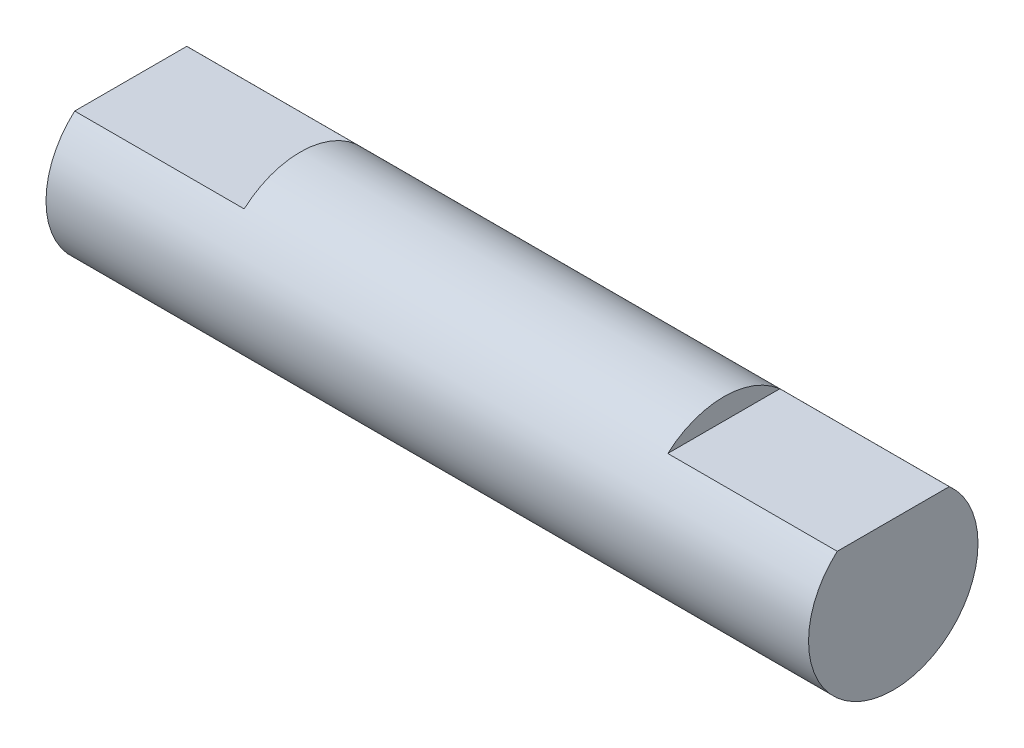
ISO-10303-21;
HEADER;
FILE_DESCRIPTION(('STEP AP214'),'2;1');
FILE_NAME('part.step','',(''),(''),'','','');
FILE_SCHEMA(('AUTOMOTIVE_DESIGN { 1 0 10303 214 1 1 1 1 }'));
ENDSEC;
DATA;
#1=APPLICATION_CONTEXT('core data for automotive mechanical design processes');
#2=APPLICATION_PROTOCOL_DEFINITION('international standard','automotive_design',2000,#1);
#3=PRODUCT_CONTEXT('',#1,'mechanical');
#4=PRODUCT('Part','Part','',(#3));
#5=PRODUCT_RELATED_PRODUCT_CATEGORY('part','',(#4));
#6=PRODUCT_DEFINITION_FORMATION('','',#4);
#7=PRODUCT_DEFINITION_CONTEXT('part definition',#1,'design');
#8=PRODUCT_DEFINITION('design','',#6,#7);
#9=PRODUCT_DEFINITION_SHAPE('','',#8);
#10=(LENGTH_UNIT() NAMED_UNIT(*) SI_UNIT(.MILLI.,.METRE.));
#11=(NAMED_UNIT(*) PLANE_ANGLE_UNIT() SI_UNIT($,.RADIAN.));
#12=(NAMED_UNIT(*) SI_UNIT($,.STERADIAN.) SOLID_ANGLE_UNIT());
#13=UNCERTAINTY_MEASURE_WITH_UNIT(LENGTH_MEASURE(1.E-05),#10,'distance_accuracy_value','');
#14=(GEOMETRIC_REPRESENTATION_CONTEXT(3) GLOBAL_UNCERTAINTY_ASSIGNED_CONTEXT((#13)) GLOBAL_UNIT_ASSIGNED_CONTEXT((#10,
#11,#12)) REPRESENTATION_CONTEXT('',''));
#15=CARTESIAN_POINT('',(0.,0.,0.));
#16=DIRECTION('',(0.,0.,1.));
#17=DIRECTION('',(1.,0.,0.));
#18=AXIS2_PLACEMENT_3D('',#15,#16,#17);
#19=CARTESIAN_POINT('',(28.575,0.,0.));
#20=DIRECTION('',(-1.,0.,0.));
#21=DIRECTION('',(0.,0.,1.));
#22=AXIS2_PLACEMENT_3D('',#19,#20,#21);
#23=CYLINDRICAL_SURFACE('',#22,3.175);
#24=CARTESIAN_POINT('',(28.575,0.,0.));
#25=DIRECTION('',(1.,0.,0.));
#26=DIRECTION('',(0.,0.,-1.));
#27=AXIS2_PLACEMENT_3D('',#24,#25,#26);
#28=CIRCLE('',#27,3.175);
#29=CARTESIAN_POINT('',(28.575,2.38125,2.10006510315752));
#30=VERTEX_POINT('',#29);
#31=CARTESIAN_POINT('',(28.575,2.38125,-2.10006510315752));
#32=VERTEX_POINT('',#31);
#33=EDGE_CURVE('E85',#30,#32,#28,.T.);
#34=ORIENTED_EDGE('',*,*,#33,.F.);
#35=DIRECTION('',(-1.,0.,0.));
#36=VECTOR('',#35,1.);
#37=CARTESIAN_POINT('',(28.575,2.38125,2.10006510315752));
#38=LINE('',#37,#36);
#39=CARTESIAN_POINT('',(22.225,2.38125,2.10006510315752));
#40=VERTEX_POINT('',#39);
#41=EDGE_CURVE('E55',#30,#40,#38,.T.);
#42=ORIENTED_EDGE('',*,*,#41,.T.);
#43=CARTESIAN_POINT('',(22.225,0.,0.));
#44=DIRECTION('',(-1.,0.,0.));
#45=DIRECTION('',(0.,0.,1.));
#46=AXIS2_PLACEMENT_3D('',#43,#44,#45);
#47=CIRCLE('',#46,3.175);
#48=CARTESIAN_POINT('',(22.225,2.38125,-2.10006510315752));
#49=VERTEX_POINT('',#48);
#50=EDGE_CURVE('E79',#40,#49,#47,.T.);
#51=ORIENTED_EDGE('',*,*,#50,.T.);
#52=DIRECTION('',(-1.,0.,0.));
#53=VECTOR('',#52,1.);
#54=CARTESIAN_POINT('',(28.575,2.38125,-2.10006510315752));
#55=LINE('',#54,#53);
#56=EDGE_CURVE('E90',#49,#32,#55,.F.);
#57=ORIENTED_EDGE('',*,*,#56,.T.);
#58=EDGE_LOOP('',(#34,#42,#51,#57));
#59=FACE_BOUND('',#58,.T.);
#60=DIRECTION('',(-1.,0.,0.));
#61=VECTOR('',#60,1.);
#62=CARTESIAN_POINT('',(28.575,2.38125,-2.10006510315752));
#63=LINE('',#62,#61);
#64=CARTESIAN_POINT('',(6.35,2.38125,-2.10006510315752));
#65=VERTEX_POINT('',#64);
#66=CARTESIAN_POINT('',(0.,2.38125,-2.10006510315752));
#67=VERTEX_POINT('',#66);
#68=EDGE_CURVE('E47',#65,#67,#63,.T.);
#69=ORIENTED_EDGE('',*,*,#68,.F.);
#70=CARTESIAN_POINT('',(6.35,0.,0.));
#71=DIRECTION('',(1.,0.,0.));
#72=DIRECTION('',(0.,0.,-1.));
#73=AXIS2_PLACEMENT_3D('',#70,#71,#72);
#74=CIRCLE('',#73,3.175);
#75=CARTESIAN_POINT('',(6.35,2.38125,2.10006510315752));
#76=VERTEX_POINT('',#75);
#77=EDGE_CURVE('E11',#65,#76,#74,.T.);
#78=ORIENTED_EDGE('',*,*,#77,.T.);
#79=DIRECTION('',(-1.,0.,0.));
#80=VECTOR('',#79,1.);
#81=CARTESIAN_POINT('',(28.575,2.38125,2.10006510315752));
#82=LINE('',#81,#80);
#83=CARTESIAN_POINT('',(0.,2.38125,2.10006510315752));
#84=VERTEX_POINT('',#83);
#85=EDGE_CURVE('E74',#84,#76,#82,.F.);
#86=ORIENTED_EDGE('',*,*,#85,.F.);
#87=CARTESIAN_POINT('',(0.,0.,0.));
#88=DIRECTION('',(1.,0.,0.));
#89=DIRECTION('',(0.,0.,-1.));
#90=AXIS2_PLACEMENT_3D('',#87,#88,#89);
#91=CIRCLE('',#90,3.175);
#92=EDGE_CURVE('E81',#84,#67,#91,.T.);
#93=ORIENTED_EDGE('',*,*,#92,.T.);
#94=EDGE_LOOP('',(#69,#78,#86,#93));
#95=FACE_BOUND('',#94,.T.);
#96=ADVANCED_FACE('F33',(#59,#95),#23,.T.);
#97=CARTESIAN_POINT('',(0.,0.,0.));
#98=DIRECTION('',(1.,0.,0.));
#99=DIRECTION('',(0.,0.,-1.));
#100=AXIS2_PLACEMENT_3D('',#97,#98,#99);
#101=PLANE('',#100);
#102=DIRECTION('',(0.,0.,1.));
#103=VECTOR('',#102,1.);
#104=CARTESIAN_POINT('',(0.,2.38125,0.));
#105=LINE('',#104,#103);
#106=EDGE_CURVE('E40',#67,#84,#105,.T.);
#107=ORIENTED_EDGE('',*,*,#106,.F.);
#108=ORIENTED_EDGE('',*,*,#92,.F.);
#109=EDGE_LOOP('',(#107,#108));
#110=FACE_BOUND('',#109,.T.);
#111=ADVANCED_FACE('F84',(#110),#101,.F.);
#112=CARTESIAN_POINT('',(28.575,0.,0.));
#113=DIRECTION('',(1.,0.,0.));
#114=DIRECTION('',(0.,0.,-1.));
#115=AXIS2_PLACEMENT_3D('',#112,#113,#114);
#116=PLANE('',#115);
#117=DIRECTION('',(0.,0.,-1.));
#118=VECTOR('',#117,1.);
#119=CARTESIAN_POINT('',(28.575,2.38125,0.));
#120=LINE('',#119,#118);
#121=EDGE_CURVE('E88',#30,#32,#120,.T.);
#122=ORIENTED_EDGE('',*,*,#121,.F.);
#123=ORIENTED_EDGE('',*,*,#33,.T.);
#124=EDGE_LOOP('',(#122,#123));
#125=FACE_BOUND('',#124,.T.);
#126=ADVANCED_FACE('F121',(#125),#116,.T.);
#127=CARTESIAN_POINT('',(22.225,0.,0.));
#128=DIRECTION('',(-1.,0.,0.));
#129=DIRECTION('',(0.,0.,1.));
#130=AXIS2_PLACEMENT_3D('',#127,#128,#129);
#131=PLANE('',#130);
#132=DIRECTION('',(0.,0.,-1.));
#133=VECTOR('',#132,1.);
#134=CARTESIAN_POINT('',(22.225,2.38125,4.7625));
#135=LINE('',#134,#133);
#136=EDGE_CURVE('E101',#40,#49,#135,.T.);
#137=ORIENTED_EDGE('',*,*,#136,.T.);
#138=ORIENTED_EDGE('',*,*,#50,.F.);
#139=EDGE_LOOP('',(#137,#138));
#140=FACE_BOUND('',#139,.T.);
#141=ADVANCED_FACE('F100',(#140),#131,.F.);
#142=CARTESIAN_POINT('',(22.225,2.38125,4.7625));
#143=DIRECTION('',(0.,-1.,0.));
#144=DIRECTION('',(0.,0.,-1.));
#145=AXIS2_PLACEMENT_3D('',#142,#143,#144);
#146=PLANE('',#145);
#147=ORIENTED_EDGE('',*,*,#121,.T.);
#148=ORIENTED_EDGE('',*,*,#56,.F.);
#149=ORIENTED_EDGE('',*,*,#136,.F.);
#150=ORIENTED_EDGE('',*,*,#41,.F.);
#151=EDGE_LOOP('',(#147,#148,#149,#150));
#152=FACE_BOUND('',#151,.T.);
#153=ADVANCED_FACE('F102',(#152),#146,.F.);
#154=CARTESIAN_POINT('',(6.35,0.,0.));
#155=DIRECTION('',(1.,0.,0.));
#156=DIRECTION('',(0.,0.,1.));
#157=AXIS2_PLACEMENT_3D('',#154,#155,#156);
#158=PLANE('',#157);
#159=DIRECTION('',(0.,0.,-1.));
#160=VECTOR('',#159,1.);
#161=CARTESIAN_POINT('',(6.35,2.38125,4.7625));
#162=LINE('',#161,#160);
#163=EDGE_CURVE('E82',#76,#65,#162,.T.);
#164=ORIENTED_EDGE('',*,*,#163,.F.);
#165=ORIENTED_EDGE('',*,*,#77,.F.);
#166=EDGE_LOOP('',(#164,#165));
#167=FACE_BOUND('',#166,.T.);
#168=ADVANCED_FACE('F108',(#167),#158,.F.);
#169=CARTESIAN_POINT('',(6.35,2.38125,4.7625));
#170=DIRECTION('',(0.,1.,0.));
#171=DIRECTION('',(0.,0.,1.));
#172=AXIS2_PLACEMENT_3D('',#169,#170,#171);
#173=PLANE('',#172);
#174=ORIENTED_EDGE('',*,*,#68,.T.);
#175=ORIENTED_EDGE('',*,*,#106,.T.);
#176=ORIENTED_EDGE('',*,*,#85,.T.);
#177=ORIENTED_EDGE('',*,*,#163,.T.);
#178=EDGE_LOOP('',(#174,#175,#176,#177));
#179=FACE_BOUND('',#178,.T.);
#180=ADVANCED_FACE('F73',(#179),#173,.T.);
#181=CLOSED_SHELL('',(#96,#111,#126,#141,#153,#168,#180));
#182=MANIFOLD_SOLID_BREP('B2',#181);
#183=ADVANCED_BREP_SHAPE_REPRESENTATION('',(#18,#182),#14);
#184=SHAPE_DEFINITION_REPRESENTATION(#9,#183);
ENDSEC;
END-ISO-10303-21;
